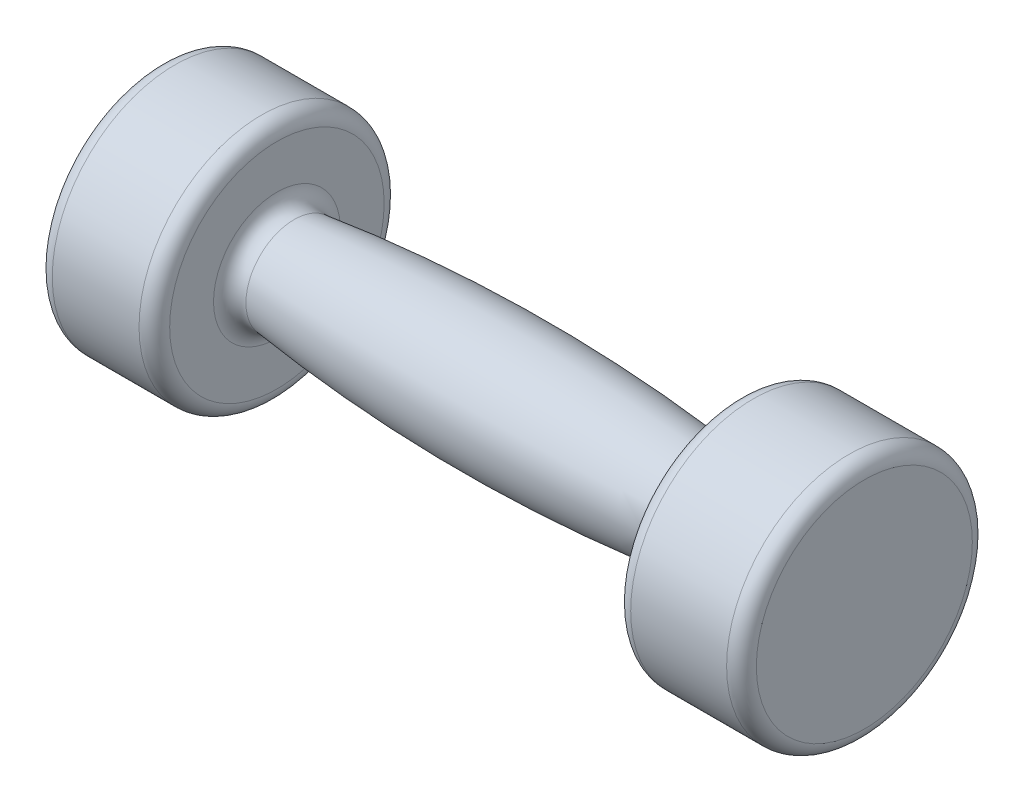
ISO-10303-21;
HEADER;
FILE_DESCRIPTION(('STEP AP214'),'2;1');
FILE_NAME('part.step','',(''),(''),'','','');
FILE_SCHEMA(('AUTOMOTIVE_DESIGN { 1 0 10303 214 1 1 1 1 }'));
ENDSEC;
DATA;
#1=APPLICATION_CONTEXT('core data for automotive mechanical design processes');
#2=APPLICATION_PROTOCOL_DEFINITION('international standard','automotive_design',2000,#1);
#3=PRODUCT_CONTEXT('',#1,'mechanical');
#4=PRODUCT('Part','Part','',(#3));
#5=PRODUCT_RELATED_PRODUCT_CATEGORY('part','',(#4));
#6=PRODUCT_DEFINITION_FORMATION('','',#4);
#7=PRODUCT_DEFINITION_CONTEXT('part definition',#1,'design');
#8=PRODUCT_DEFINITION('design','',#6,#7);
#9=PRODUCT_DEFINITION_SHAPE('','',#8);
#10=(LENGTH_UNIT() NAMED_UNIT(*) SI_UNIT(.MILLI.,.METRE.));
#11=(NAMED_UNIT(*) PLANE_ANGLE_UNIT() SI_UNIT($,.RADIAN.));
#12=(NAMED_UNIT(*) SI_UNIT($,.STERADIAN.) SOLID_ANGLE_UNIT());
#13=UNCERTAINTY_MEASURE_WITH_UNIT(LENGTH_MEASURE(1.E-05),#10,'distance_accuracy_value','');
#14=(GEOMETRIC_REPRESENTATION_CONTEXT(3) GLOBAL_UNCERTAINTY_ASSIGNED_CONTEXT((#13)) GLOBAL_UNIT_ASSIGNED_CONTEXT((#10,
#11,#12)) REPRESENTATION_CONTEXT('',''));
#15=CARTESIAN_POINT('',(0.,0.,0.));
#16=DIRECTION('',(0.,0.,1.));
#17=DIRECTION('',(1.,0.,0.));
#18=AXIS2_PLACEMENT_3D('',#15,#16,#17);
#19=CARTESIAN_POINT('',(141.718579210721,0.,0.));
#20=DIRECTION('',(1.,0.,0.));
#21=DIRECTION('',(0.,0.,-1.));
#22=AXIS2_PLACEMENT_3D('',#19,#20,#21);
#23=PLANE('',#22);
#24=CARTESIAN_POINT('',(141.718579210721,0.,0.));
#25=DIRECTION('',(-1.,0.,0.));
#26=DIRECTION('',(0.,0.,1.));
#27=AXIS2_PLACEMENT_3D('',#24,#25,#26);
#28=CIRCLE('',#27,35.2475732515257);
#29=CARTESIAN_POINT('',(141.718579210721,0.,35.2475732515257));
#30=VERTEX_POINT('',#29);
#31=EDGE_CURVE('E10',#30,#30,#28,.T.);
#32=ORIENTED_EDGE('',*,*,#31,.F.);
#33=EDGE_LOOP('',(#32));
#34=FACE_BOUND('',#33,.T.);
#35=ADVANCED_FACE('F33',(#34),#23,.T.);
#36=CARTESIAN_POINT('',(136.761290734868,0.,0.));
#37=DIRECTION('',(-1.,0.,0.));
#38=DIRECTION('',(0.,0.,1.));
#39=AXIS2_PLACEMENT_3D('',#36,#37,#38);
#40=TOROIDAL_SURFACE('',#39,35.0382960613146,4.96170393868548);
#41=ORIENTED_EDGE('',*,*,#31,.T.);
#42=EDGE_LOOP('',(#41));
#43=FACE_BOUND('',#42,.T.);
#44=CARTESIAN_POINT('',(136.761290734868,0.,0.));
#45=DIRECTION('',(-1.,0.,0.));
#46=DIRECTION('',(0.,0.,1.));
#47=AXIS2_PLACEMENT_3D('',#44,#45,#46);
#48=CIRCLE('',#47,40.);
#49=CARTESIAN_POINT('',(136.761290734868,0.,40.));
#50=VERTEX_POINT('',#49);
#51=EDGE_CURVE('E39',#50,#50,#48,.T.);
#52=ORIENTED_EDGE('',*,*,#51,.F.);
#53=EDGE_LOOP('',(#52));
#54=FACE_BOUND('',#53,.T.);
#55=ADVANCED_FACE('F93',(#43,#54),#40,.T.);
#56=CARTESIAN_POINT('',(-88.2814207892795,0.,0.));
#57=DIRECTION('',(-1.,0.,0.));
#58=DIRECTION('',(0.,0.,1.));
#59=AXIS2_PLACEMENT_3D('',#56,#57,#58);
#60=CYLINDRICAL_SURFACE('',#59,40.);
#61=ORIENTED_EDGE('',*,*,#51,.T.);
#62=EDGE_LOOP('',(#61));
#63=FACE_BOUND('',#62,.T.);
#64=CARTESIAN_POINT('',(105.458951949163,0.,0.));
#65=DIRECTION('',(-1.,0.,0.));
#66=DIRECTION('',(0.,0.,1.));
#67=AXIS2_PLACEMENT_3D('',#64,#65,#66);
#68=CIRCLE('',#67,40.);
#69=CARTESIAN_POINT('',(105.458951949163,0.,40.));
#70=VERTEX_POINT('',#69);
#71=EDGE_CURVE('E43',#70,#70,#68,.T.);
#72=ORIENTED_EDGE('',*,*,#71,.F.);
#73=EDGE_LOOP('',(#72));
#74=FACE_BOUND('',#73,.T.);
#75=ADVANCED_FACE('F98',(#63,#74),#60,.T.);
#76=CARTESIAN_POINT('',(105.458951949163,0.,0.));
#77=DIRECTION('',(-1.,0.,0.));
#78=DIRECTION('',(0.,0.,1.));
#79=AXIS2_PLACEMENT_3D('',#76,#77,#78);
#80=TOROIDAL_SURFACE('',#79,35.0431483505182,4.95685164948187);
#81=ORIENTED_EDGE('',*,*,#71,.T.);
#82=EDGE_LOOP('',(#81));
#83=FACE_BOUND('',#82,.T.);
#84=CARTESIAN_POINT('',(100.503224158311,0.,0.));
#85=DIRECTION('',(-1.,0.,0.));
#86=DIRECTION('',(0.,0.,1.));
#87=AXIS2_PLACEMENT_3D('',#84,#85,#86);
#88=CIRCLE('',#87,35.1486961498725);
#89=CARTESIAN_POINT('',(100.503224158311,0.,35.1486961498725));
#90=VERTEX_POINT('',#89);
#91=EDGE_CURVE('E47',#90,#90,#88,.T.);
#92=ORIENTED_EDGE('',*,*,#91,.F.);
#93=EDGE_LOOP('',(#92));
#94=FACE_BOUND('',#93,.T.);
#95=ADVANCED_FACE('F102',(#83,#94),#80,.T.);
#96=CARTESIAN_POINT('',(100.189534276235,0.,0.));
#97=DIRECTION('',(1.,0.,0.));
#98=DIRECTION('',(0.,0.,-1.));
#99=AXIS2_PLACEMENT_3D('',#96,#97,#98);
#100=CONICAL_SURFACE('',#99,20.4201875895384,1.54950140323582);
#101=ORIENTED_EDGE('',*,*,#91,.T.);
#102=EDGE_LOOP('',(#101));
#103=FACE_BOUND('',#102,.T.);
#104=CARTESIAN_POINT('',(100.189534276235,0.,0.));
#105=DIRECTION('',(-1.,0.,0.));
#106=DIRECTION('',(0.,0.,1.));
#107=AXIS2_PLACEMENT_3D('',#104,#105,#106);
#108=CIRCLE('',#107,20.4201875895384);
#109=CARTESIAN_POINT('',(100.189534276235,0.,20.4201875895384));
#110=VERTEX_POINT('',#109);
#111=EDGE_CURVE('E52',#110,#110,#108,.T.);
#112=ORIENTED_EDGE('',*,*,#111,.F.);
#113=EDGE_LOOP('',(#112));
#114=FACE_BOUND('',#113,.T.);
#115=ADVANCED_FACE('F108',(#103,#114),#100,.T.);
#116=CARTESIAN_POINT('',(95.1906679178178,0.,0.));
#117=DIRECTION('',(-1.,0.,0.));
#118=DIRECTION('',(0.,0.,1.));
#119=AXIS2_PLACEMENT_3D('',#116,#117,#118);
#120=TOROIDAL_SURFACE('',#119,20.5266541602752,4.99999999999996);
#121=ORIENTED_EDGE('',*,*,#111,.T.);
#122=EDGE_LOOP('',(#121));
#123=FACE_BOUND('',#122,.T.);
#124=CARTESIAN_POINT('',(94.5700710538115,0.,0.));
#125=DIRECTION('',(-1.,0.,0.));
#126=DIRECTION('',(0.,0.,1.));
#127=AXIS2_PLACEMENT_3D('',#124,#125,#126);
#128=CIRCLE('',#127,15.5653176939201);
#129=CARTESIAN_POINT('',(94.5700710538115,0.,15.5653176939201));
#130=VERTEX_POINT('',#129);
#131=EDGE_CURVE('E55',#130,#130,#128,.T.);
#132=ORIENTED_EDGE('',*,*,#131,.F.);
#133=EDGE_LOOP('',(#132));
#134=FACE_BOUND('',#133,.T.);
#135=ADVANCED_FACE('F112',(#123,#134),#120,.F.);
#136=CARTESIAN_POINT('',(24.4482531185657,0.,0.));
#137=DIRECTION('',(-1.,0.,0.));
#138=DIRECTION('',(0.,0.,1.));
#139=AXIS2_PLACEMENT_3D('',#136,#137,#138);
#140=DEGENERATE_TOROIDAL_SURFACE('',#139,545.020712605092,564.954658992161,.F.);
#141=ORIENTED_EDGE('',*,*,#131,.T.);
#142=EDGE_LOOP('',(#141));
#143=FACE_BOUND('',#142,.T.);
#144=CARTESIAN_POINT('',(-44.3998413160524,0.,0.));
#145=DIRECTION('',(-1.,0.,0.));
#146=DIRECTION('',(0.,0.,1.));
#147=AXIS2_PLACEMENT_3D('',#144,#145,#146);
#148=CIRCLE('',#147,15.7231742181801);
#149=CARTESIAN_POINT('',(-44.3998413160524,0.,15.7231742181801));
#150=VERTEX_POINT('',#149);
#151=EDGE_CURVE('E58',#150,#150,#148,.T.);
#152=ORIENTED_EDGE('',*,*,#151,.F.);
#153=EDGE_LOOP('',(#152));
#154=FACE_BOUND('',#153,.T.);
#155=ADVANCED_FACE('F116',(#143,#154),#140,.F.);
#156=CARTESIAN_POINT('',(-45.0091653860356,0.,0.));
#157=DIRECTION('',(-1.,0.,0.));
#158=DIRECTION('',(0.,0.,1.));
#159=AXIS2_PLACEMENT_3D('',#156,#157,#158);
#160=TOROIDAL_SURFACE('',#159,20.6859077570414,4.99999999999997);
#161=ORIENTED_EDGE('',*,*,#151,.T.);
#162=EDGE_LOOP('',(#161));
#163=FACE_BOUND('',#162,.T.);
#164=CARTESIAN_POINT('',(-50.0091653860356,0.,0.));
#165=DIRECTION('',(-1.,0.,0.));
#166=DIRECTION('',(0.,0.,1.));
#167=AXIS2_PLACEMENT_3D('',#164,#165,#166);
#168=CIRCLE('',#167,20.6859077570414);
#169=CARTESIAN_POINT('',(-50.0091653860356,0.,20.6859077570414));
#170=VERTEX_POINT('',#169);
#171=EDGE_CURVE('E61',#170,#170,#168,.T.);
#172=ORIENTED_EDGE('',*,*,#171,.F.);
#173=EDGE_LOOP('',(#172));
#174=FACE_BOUND('',#173,.T.);
#175=ADVANCED_FACE('F120',(#163,#174),#160,.F.);
#176=CARTESIAN_POINT('',(-50.0091653860356,-35.0000000000001,0.));
#177=DIRECTION('',(1.,0.,0.));
#178=DIRECTION('',(0.,0.,-1.));
#179=AXIS2_PLACEMENT_3D('',#176,#177,#178);
#180=PLANE('',#179);
#181=ORIENTED_EDGE('',*,*,#171,.T.);
#182=EDGE_LOOP('',(#181));
#183=FACE_BOUND('',#182,.T.);
#184=CARTESIAN_POINT('',(-50.0091653860356,0.,0.));
#185=DIRECTION('',(-1.,0.,0.));
#186=DIRECTION('',(0.,0.,1.));
#187=AXIS2_PLACEMENT_3D('',#184,#185,#186);
#188=CIRCLE('',#187,35.0000000000001);
#189=CARTESIAN_POINT('',(-50.0091653860356,0.,35.0000000000001));
#190=VERTEX_POINT('',#189);
#191=EDGE_CURVE('E64',#190,#190,#188,.T.);
#192=ORIENTED_EDGE('',*,*,#191,.F.);
#193=EDGE_LOOP('',(#192));
#194=FACE_BOUND('',#193,.T.);
#195=ADVANCED_FACE('F124',(#183,#194),#180,.T.);
#196=CARTESIAN_POINT('',(-55.0091653860356,0.,0.));
#197=DIRECTION('',(-1.,0.,0.));
#198=DIRECTION('',(0.,0.,1.));
#199=AXIS2_PLACEMENT_3D('',#196,#197,#198);
#200=TOROIDAL_SURFACE('',#199,35.0000000000001,4.99999999999998);
#201=ORIENTED_EDGE('',*,*,#191,.T.);
#202=EDGE_LOOP('',(#201));
#203=FACE_BOUND('',#202,.T.);
#204=CARTESIAN_POINT('',(-55.0091653860356,0.,0.));
#205=DIRECTION('',(-1.,0.,0.));
#206=DIRECTION('',(0.,0.,1.));
#207=AXIS2_PLACEMENT_3D('',#204,#205,#206);
#208=CIRCLE('',#207,40.);
#209=CARTESIAN_POINT('',(-55.0091653860356,0.,40.));
#210=VERTEX_POINT('',#209);
#211=EDGE_CURVE('E67',#210,#210,#208,.T.);
#212=ORIENTED_EDGE('',*,*,#211,.F.);
#213=EDGE_LOOP('',(#212));
#214=FACE_BOUND('',#213,.T.);
#215=ADVANCED_FACE('F89',(#203,#214),#200,.T.);
#216=CARTESIAN_POINT('',(-88.2814207892795,0.,0.));
#217=DIRECTION('',(-1.,0.,0.));
#218=DIRECTION('',(0.,0.,1.));
#219=AXIS2_PLACEMENT_3D('',#216,#217,#218);
#220=CYLINDRICAL_SURFACE('',#219,40.);
#221=ORIENTED_EDGE('',*,*,#211,.T.);
#222=EDGE_LOOP('',(#221));
#223=FACE_BOUND('',#222,.T.);
#224=CARTESIAN_POINT('',(-83.3241323134266,0.,0.));
#225=DIRECTION('',(-1.,0.,0.));
#226=DIRECTION('',(0.,0.,1.));
#227=AXIS2_PLACEMENT_3D('',#224,#225,#226);
#228=CIRCLE('',#227,40.);
#229=CARTESIAN_POINT('',(-83.3241323134266,0.,40.));
#230=VERTEX_POINT('',#229);
#231=EDGE_CURVE('E70',#230,#230,#228,.T.);
#232=ORIENTED_EDGE('',*,*,#231,.F.);
#233=EDGE_LOOP('',(#232));
#234=FACE_BOUND('',#233,.T.);
#235=ADVANCED_FACE('F81',(#223,#234),#220,.T.);
#236=CARTESIAN_POINT('',(-83.3241323134266,0.,0.));
#237=DIRECTION('',(-1.,0.,0.));
#238=DIRECTION('',(0.,0.,1.));
#239=AXIS2_PLACEMENT_3D('',#236,#237,#238);
#240=TOROIDAL_SURFACE('',#239,35.0382960613146,4.96170393868547);
#241=ORIENTED_EDGE('',*,*,#231,.T.);
#242=EDGE_LOOP('',(#241));
#243=FACE_BOUND('',#242,.T.);
#244=CARTESIAN_POINT('',(-88.2814207892795,0.,0.));
#245=DIRECTION('',(-1.,0.,0.));
#246=DIRECTION('',(0.,0.,1.));
#247=AXIS2_PLACEMENT_3D('',#244,#245,#246);
#248=CIRCLE('',#247,35.2475732515257);
#249=CARTESIAN_POINT('',(-88.2814207892795,0.,35.2475732515257));
#250=VERTEX_POINT('',#249);
#251=EDGE_CURVE('E73',#250,#250,#248,.T.);
#252=ORIENTED_EDGE('',*,*,#251,.F.);
#253=EDGE_LOOP('',(#252));
#254=FACE_BOUND('',#253,.T.);
#255=ADVANCED_FACE('F79',(#243,#254),#240,.T.);
#256=CARTESIAN_POINT('',(-88.2814207892795,0.,0.));
#257=DIRECTION('',(-1.,0.,0.));
#258=DIRECTION('',(0.,0.,1.));
#259=AXIS2_PLACEMENT_3D('',#256,#257,#258);
#260=PLANE('',#259);
#261=ORIENTED_EDGE('',*,*,#251,.T.);
#262=EDGE_LOOP('',(#261));
#263=FACE_BOUND('',#262,.T.);
#264=ADVANCED_FACE('F77',(#263),#260,.T.);
#265=CLOSED_SHELL('',(#35,#55,#75,#95,#115,#135,#155,#175,#195,#215,#235,#255,#264));
#266=MANIFOLD_SOLID_BREP('B2',#265);
#267=ADVANCED_BREP_SHAPE_REPRESENTATION('',(#18,#266),#14);
#268=SHAPE_DEFINITION_REPRESENTATION(#9,#267);
ENDSEC;
END-ISO-10303-21;
